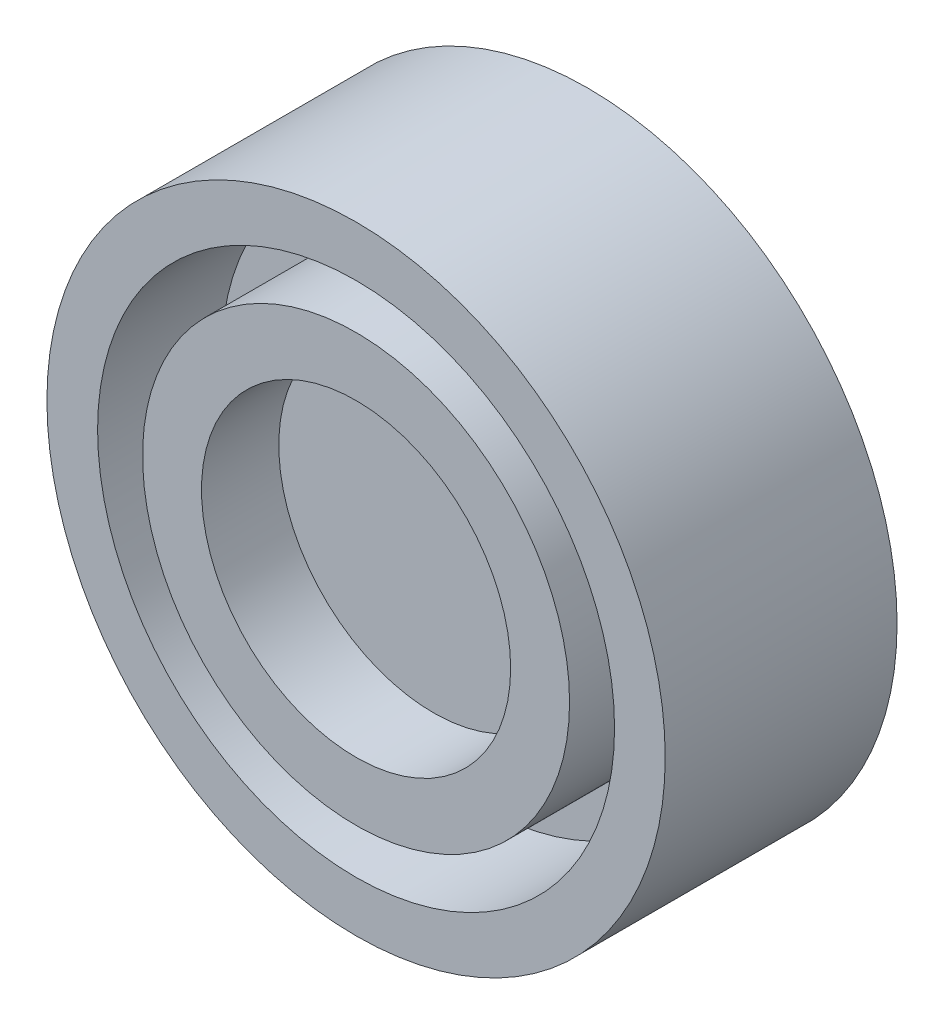
ISO-10303-21;
HEADER;
FILE_DESCRIPTION(('STEP AP214'),'2;1');
FILE_NAME('part.step','',(''),(''),'','','');
FILE_SCHEMA(('AUTOMOTIVE_DESIGN { 1 0 10303 214 1 1 1 1 }'));
ENDSEC;
DATA;
#1=APPLICATION_CONTEXT('core data for automotive mechanical design processes');
#2=APPLICATION_PROTOCOL_DEFINITION('international standard','automotive_design',2000,#1);
#3=PRODUCT_CONTEXT('',#1,'mechanical');
#4=PRODUCT('Part','Part','',(#3));
#5=PRODUCT_RELATED_PRODUCT_CATEGORY('part','',(#4));
#6=PRODUCT_DEFINITION_FORMATION('','',#4);
#7=PRODUCT_DEFINITION_CONTEXT('part definition',#1,'design');
#8=PRODUCT_DEFINITION('design','',#6,#7);
#9=PRODUCT_DEFINITION_SHAPE('','',#8);
#10=(LENGTH_UNIT() NAMED_UNIT(*) SI_UNIT(.MILLI.,.METRE.));
#11=(NAMED_UNIT(*) PLANE_ANGLE_UNIT() SI_UNIT($,.RADIAN.));
#12=(NAMED_UNIT(*) SI_UNIT($,.STERADIAN.) SOLID_ANGLE_UNIT());
#13=UNCERTAINTY_MEASURE_WITH_UNIT(LENGTH_MEASURE(1.E-05),#10,'distance_accuracy_value','');
#14=(GEOMETRIC_REPRESENTATION_CONTEXT(3) GLOBAL_UNCERTAINTY_ASSIGNED_CONTEXT((#13)) GLOBAL_UNIT_ASSIGNED_CONTEXT((#10,
#11,#12)) REPRESENTATION_CONTEXT('',''));
#15=CARTESIAN_POINT('',(0.,0.,0.));
#16=DIRECTION('',(0.,0.,1.));
#17=DIRECTION('',(1.,0.,0.));
#18=AXIS2_PLACEMENT_3D('',#15,#16,#17);
#19=CARTESIAN_POINT('',(0.,0.,15.));
#20=DIRECTION('',(0.,0.,-1.));
#21=DIRECTION('',(-1.,0.,0.));
#22=AXIS2_PLACEMENT_3D('',#19,#20,#21);
#23=CYLINDRICAL_SURFACE('',#22,20.);
#24=CARTESIAN_POINT('',(0.,0.,15.));
#25=DIRECTION('',(0.,0.,1.));
#26=DIRECTION('',(1.,0.,0.));
#27=AXIS2_PLACEMENT_3D('',#24,#25,#26);
#28=CIRCLE('',#27,20.);
#29=CARTESIAN_POINT('',(20.,0.,15.));
#30=VERTEX_POINT('',#29);
#31=EDGE_CURVE('E10',#30,#30,#28,.T.);
#32=ORIENTED_EDGE('',*,*,#31,.F.);
#33=EDGE_LOOP('',(#32));
#34=FACE_BOUND('',#33,.T.);
#35=CARTESIAN_POINT('',(0.,0.,0.));
#36=DIRECTION('',(0.,0.,1.));
#37=DIRECTION('',(1.,0.,0.));
#38=AXIS2_PLACEMENT_3D('',#35,#36,#37);
#39=CIRCLE('',#38,20.);
#40=CARTESIAN_POINT('',(20.,0.,0.));
#41=VERTEX_POINT('',#40);
#42=EDGE_CURVE('E34',#41,#41,#39,.T.);
#43=ORIENTED_EDGE('',*,*,#42,.T.);
#44=EDGE_LOOP('',(#43));
#45=FACE_BOUND('',#44,.T.);
#46=ADVANCED_FACE('F31',(#34,#45),#23,.T.);
#47=CARTESIAN_POINT('',(0.,0.,15.));
#48=DIRECTION('',(0.,0.,1.));
#49=DIRECTION('',(1.,0.,0.));
#50=AXIS2_PLACEMENT_3D('',#47,#48,#49);
#51=PLANE('',#50);
#52=CARTESIAN_POINT('',(0.,0.,15.));
#53=DIRECTION('',(0.,0.,1.));
#54=DIRECTION('',(1.,0.,0.));
#55=AXIS2_PLACEMENT_3D('',#52,#53,#54);
#56=CIRCLE('',#55,16.7223469096226);
#57=CARTESIAN_POINT('',(16.7223469096226,0.,15.));
#58=VERTEX_POINT('',#57);
#59=EDGE_CURVE('E49',#58,#58,#56,.T.);
#60=ORIENTED_EDGE('',*,*,#59,.F.);
#61=EDGE_LOOP('',(#60));
#62=FACE_BOUND('',#61,.T.);
#63=ORIENTED_EDGE('',*,*,#31,.T.);
#64=EDGE_LOOP('',(#63));
#65=FACE_BOUND('',#64,.T.);
#66=ADVANCED_FACE('F77',(#62,#65),#51,.T.);
#67=CARTESIAN_POINT('',(0.,0.,0.));
#68=DIRECTION('',(0.,0.,1.));
#69=DIRECTION('',(1.,0.,0.));
#70=AXIS2_PLACEMENT_3D('',#67,#68,#69);
#71=PLANE('',#70);
#72=ORIENTED_EDGE('',*,*,#42,.F.);
#73=EDGE_LOOP('',(#72));
#74=FACE_BOUND('',#73,.T.);
#75=ADVANCED_FACE('F73',(#74),#71,.F.);
#76=CARTESIAN_POINT('',(0.,0.,7.));
#77=DIRECTION('',(0.,0.,1.));
#78=DIRECTION('',(1.,0.,0.));
#79=AXIS2_PLACEMENT_3D('',#76,#77,#78);
#80=CYLINDRICAL_SURFACE('',#79,16.7223469096226);
#81=CARTESIAN_POINT('',(0.,0.,7.));
#82=DIRECTION('',(0.,0.,1.));
#83=DIRECTION('',(1.,0.,0.));
#84=AXIS2_PLACEMENT_3D('',#81,#82,#83);
#85=CIRCLE('',#84,16.7223469096226);
#86=CARTESIAN_POINT('',(16.7223469096226,0.,7.));
#87=VERTEX_POINT('',#86);
#88=EDGE_CURVE('E46',#87,#87,#85,.T.);
#89=ORIENTED_EDGE('',*,*,#88,.F.);
#90=EDGE_LOOP('',(#89));
#91=FACE_BOUND('',#90,.T.);
#92=ORIENTED_EDGE('',*,*,#59,.T.);
#93=EDGE_LOOP('',(#92));
#94=FACE_BOUND('',#93,.T.);
#95=ADVANCED_FACE('F67',(#91,#94),#80,.F.);
#96=CARTESIAN_POINT('',(0.,0.,7.));
#97=DIRECTION('',(0.,0.,1.));
#98=DIRECTION('',(1.,0.,0.));
#99=AXIS2_PLACEMENT_3D('',#96,#97,#98);
#100=PLANE('',#99);
#101=CARTESIAN_POINT('',(0.,0.,7.));
#102=DIRECTION('',(0.,0.,1.));
#103=DIRECTION('',(1.,0.,0.));
#104=AXIS2_PLACEMENT_3D('',#101,#102,#103);
#105=CIRCLE('',#104,13.8116190349367);
#106=CARTESIAN_POINT('',(13.8116190349367,0.,7.));
#107=VERTEX_POINT('',#106);
#108=EDGE_CURVE('E52',#107,#107,#105,.T.);
#109=ORIENTED_EDGE('',*,*,#108,.F.);
#110=EDGE_LOOP('',(#109));
#111=FACE_BOUND('',#110,.T.);
#112=ORIENTED_EDGE('',*,*,#88,.T.);
#113=EDGE_LOOP('',(#112));
#114=FACE_BOUND('',#113,.T.);
#115=ADVANCED_FACE('F64',(#111,#114),#100,.T.);
#116=CARTESIAN_POINT('',(0.,0.,7.));
#117=DIRECTION('',(0.,0.,1.));
#118=DIRECTION('',(1.,0.,0.));
#119=AXIS2_PLACEMENT_3D('',#116,#117,#118);
#120=CYLINDRICAL_SURFACE('',#119,13.8116190349367);
#121=ORIENTED_EDGE('',*,*,#108,.T.);
#122=EDGE_LOOP('',(#121));
#123=FACE_BOUND('',#122,.T.);
#124=CARTESIAN_POINT('',(0.,0.,15.));
#125=DIRECTION('',(0.,0.,1.));
#126=DIRECTION('',(1.,0.,0.));
#127=AXIS2_PLACEMENT_3D('',#124,#125,#126);
#128=CIRCLE('',#127,13.8116190349367);
#129=CARTESIAN_POINT('',(13.8116190349367,0.,15.));
#130=VERTEX_POINT('',#129);
#131=EDGE_CURVE('E55',#130,#130,#128,.T.);
#132=ORIENTED_EDGE('',*,*,#131,.F.);
#133=EDGE_LOOP('',(#132));
#134=FACE_BOUND('',#133,.T.);
#135=ADVANCED_FACE('F61',(#123,#134),#120,.T.);
#136=CARTESIAN_POINT('',(0.,0.,10.));
#137=DIRECTION('',(0.,0.,1.));
#138=DIRECTION('',(1.,0.,0.));
#139=AXIS2_PLACEMENT_3D('',#136,#137,#138);
#140=PLANE('',#139);
#141=CARTESIAN_POINT('',(0.,0.,10.));
#142=DIRECTION('',(0.,0.,1.));
#143=DIRECTION('',(1.,0.,0.));
#144=AXIS2_PLACEMENT_3D('',#141,#142,#143);
#145=CIRCLE('',#144,10.);
#146=CARTESIAN_POINT('',(10.,0.,10.));
#147=VERTEX_POINT('',#146);
#148=EDGE_CURVE('E41',#147,#147,#145,.T.);
#149=ORIENTED_EDGE('',*,*,#148,.T.);
#150=EDGE_LOOP('',(#149));
#151=FACE_BOUND('',#150,.T.);
#152=ADVANCED_FACE('F94',(#151),#140,.T.);
#153=CARTESIAN_POINT('',(0.,0.,10.));
#154=DIRECTION('',(0.,0.,1.));
#155=DIRECTION('',(1.,0.,0.));
#156=AXIS2_PLACEMENT_3D('',#153,#154,#155);
#157=CYLINDRICAL_SURFACE('',#156,10.);
#158=ORIENTED_EDGE('',*,*,#148,.F.);
#159=EDGE_LOOP('',(#158));
#160=FACE_BOUND('',#159,.T.);
#161=CARTESIAN_POINT('',(0.,0.,15.));
#162=DIRECTION('',(0.,0.,1.));
#163=DIRECTION('',(1.,0.,0.));
#164=AXIS2_PLACEMENT_3D('',#161,#162,#163);
#165=CIRCLE('',#164,10.);
#166=CARTESIAN_POINT('',(10.,0.,15.));
#167=VERTEX_POINT('',#166);
#168=EDGE_CURVE('E43',#167,#167,#165,.T.);
#169=ORIENTED_EDGE('',*,*,#168,.T.);
#170=EDGE_LOOP('',(#169));
#171=FACE_BOUND('',#170,.T.);
#172=ADVANCED_FACE('F89',(#160,#171),#157,.F.);
#173=ORIENTED_EDGE('',*,*,#168,.F.);
#174=EDGE_LOOP('',(#173));
#175=FACE_BOUND('',#174,.T.);
#176=ORIENTED_EDGE('',*,*,#131,.T.);
#177=EDGE_LOOP('',(#176));
#178=FACE_BOUND('',#177,.T.);
#179=ADVANCED_FACE('F80',(#175,#178),#51,.T.);
#180=CLOSED_SHELL('',(#46,#66,#75,#95,#115,#135,#152,#172,#179));
#181=MANIFOLD_SOLID_BREP('B2',#180);
#182=ADVANCED_BREP_SHAPE_REPRESENTATION('',(#18,#181),#14);
#183=SHAPE_DEFINITION_REPRESENTATION(#9,#182);
ENDSEC;
END-ISO-10303-21;
